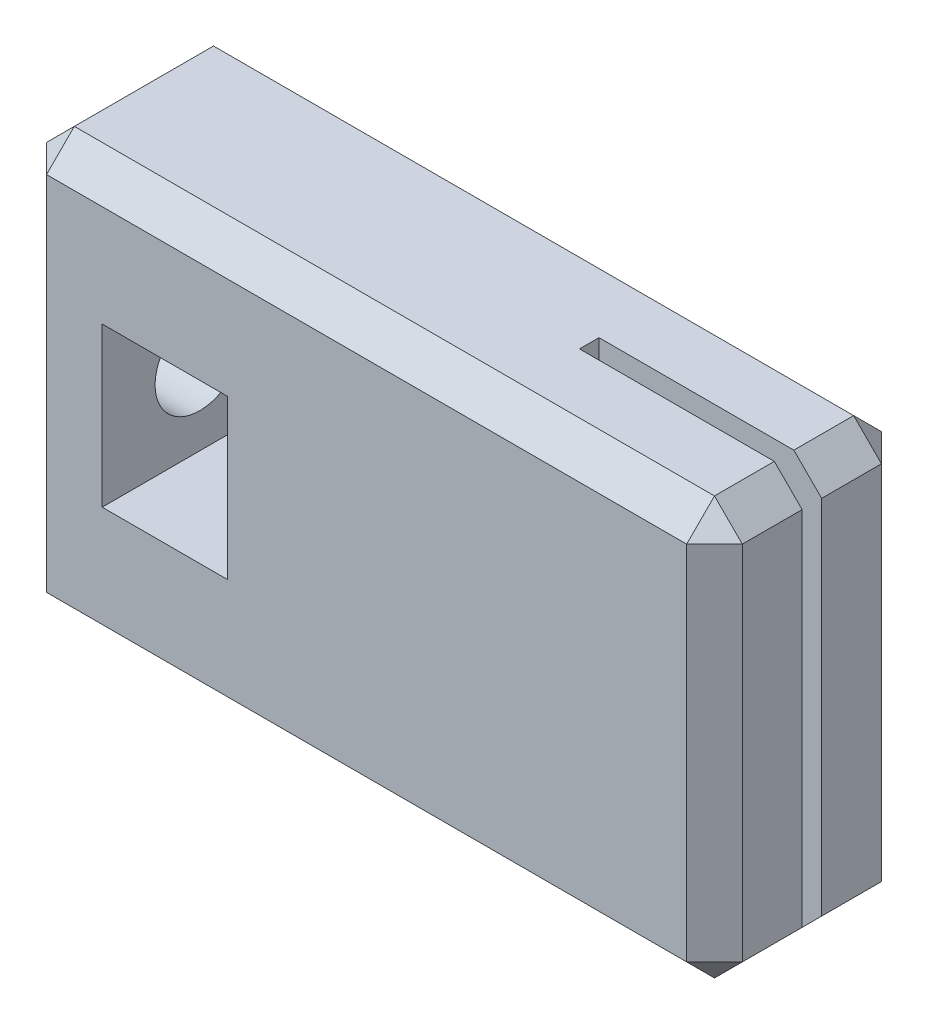
ISO-10303-21;
HEADER;
FILE_DESCRIPTION(('STEP AP214'),'2;1');
FILE_NAME('part.step','',(''),(''),'','','');
FILE_SCHEMA(('AUTOMOTIVE_DESIGN { 1 0 10303 214 1 1 1 1 }'));
ENDSEC;
DATA;
#1=APPLICATION_CONTEXT('core data for automotive mechanical design processes');
#2=APPLICATION_PROTOCOL_DEFINITION('international standard','automotive_design',2000,#1);
#3=PRODUCT_CONTEXT('',#1,'mechanical');
#4=PRODUCT('Part','Part','',(#3));
#5=PRODUCT_RELATED_PRODUCT_CATEGORY('part','',(#4));
#6=PRODUCT_DEFINITION_FORMATION('','',#4);
#7=PRODUCT_DEFINITION_CONTEXT('part definition',#1,'design');
#8=PRODUCT_DEFINITION('design','',#6,#7);
#9=PRODUCT_DEFINITION_SHAPE('','',#8);
#10=(LENGTH_UNIT() NAMED_UNIT(*) SI_UNIT(.MILLI.,.METRE.));
#11=(NAMED_UNIT(*) PLANE_ANGLE_UNIT() SI_UNIT($,.RADIAN.));
#12=(NAMED_UNIT(*) SI_UNIT($,.STERADIAN.) SOLID_ANGLE_UNIT());
#13=UNCERTAINTY_MEASURE_WITH_UNIT(LENGTH_MEASURE(1.E-05),#10,'distance_accuracy_value','');
#14=(GEOMETRIC_REPRESENTATION_CONTEXT(3) GLOBAL_UNCERTAINTY_ASSIGNED_CONTEXT((#13)) GLOBAL_UNIT_ASSIGNED_CONTEXT((#10,
#11,#12)) REPRESENTATION_CONTEXT('',''));
#15=CARTESIAN_POINT('',(0.,0.,0.));
#16=DIRECTION('',(0.,0.,1.));
#17=DIRECTION('',(1.,0.,0.));
#18=AXIS2_PLACEMENT_3D('',#15,#16,#17);
#19=CARTESIAN_POINT('',(16.,0.,0.));
#20=DIRECTION('',(-1.,0.,0.));
#21=DIRECTION('',(0.,0.,1.));
#22=AXIS2_PLACEMENT_3D('',#19,#20,#21);
#23=CYLINDRICAL_SURFACE('',#22,1.6);
#24=CARTESIAN_POINT('',(3.,0.,0.));
#25=DIRECTION('',(-1.,0.,0.));
#26=DIRECTION('',(0.,0.,1.));
#27=AXIS2_PLACEMENT_3D('',#24,#25,#26);
#28=CIRCLE('',#27,1.6);
#29=CARTESIAN_POINT('',(3.,0.,1.6));
#30=VERTEX_POINT('',#29);
#31=EDGE_CURVE('E236',#30,#30,#28,.F.);
#32=ORIENTED_EDGE('',*,*,#31,.T.);
#33=EDGE_LOOP('',(#32));
#34=FACE_BOUND('',#33,.T.);
#35=CARTESIAN_POINT('',(0.,0.,0.));
#36=DIRECTION('',(-1.,0.,0.));
#37=DIRECTION('',(0.,0.,1.));
#38=AXIS2_PLACEMENT_3D('',#35,#36,#37);
#39=CIRCLE('',#38,1.6);
#40=CARTESIAN_POINT('',(0.,0.,1.6));
#41=VERTEX_POINT('',#40);
#42=EDGE_CURVE('E233',#41,#41,#39,.T.);
#43=ORIENTED_EDGE('',*,*,#42,.T.);
#44=EDGE_LOOP('',(#43));
#45=FACE_BOUND('',#44,.T.);
#46=ADVANCED_FACE('F35',(#34,#45),#23,.F.);
#47=CARTESIAN_POINT('',(0.,7.5,-3.5));
#48=DIRECTION('',(1.,0.,0.));
#49=DIRECTION('',(0.,0.,-1.));
#50=AXIS2_PLACEMENT_3D('',#47,#48,#49);
#51=PLANE('',#50);
#52=DIRECTION('',(0.,-1.,0.));
#53=VECTOR('',#52,1.);
#54=CARTESIAN_POINT('',(0.,7.5,-2.5));
#55=LINE('',#54,#53);
#56=CARTESIAN_POINT('',(0.,6.49999999999999,-2.5));
#57=VERTEX_POINT('',#56);
#58=CARTESIAN_POINT('',(0.,-6.5,-2.5));
#59=VERTEX_POINT('',#58);
#60=EDGE_CURVE('E268',#57,#59,#55,.T.);
#61=ORIENTED_EDGE('',*,*,#60,.T.);
#62=DIRECTION('',(0.,0.,1.));
#63=VECTOR('',#62,1.);
#64=CARTESIAN_POINT('',(0.,-6.5,-3.5));
#65=LINE('',#64,#63);
#66=CARTESIAN_POINT('',(0.,-6.5,2.5));
#67=VERTEX_POINT('',#66);
#68=EDGE_CURVE('E272',#59,#67,#65,.T.);
#69=ORIENTED_EDGE('',*,*,#68,.T.);
#70=DIRECTION('',(0.,1.,0.));
#71=VECTOR('',#70,1.);
#72=CARTESIAN_POINT('',(0.,7.5,2.5));
#73=LINE('',#72,#71);
#74=CARTESIAN_POINT('',(0.,6.49999999999999,2.5));
#75=VERTEX_POINT('',#74);
#76=EDGE_CURVE('E270',#67,#75,#73,.T.);
#77=ORIENTED_EDGE('',*,*,#76,.T.);
#78=DIRECTION('',(0.,0.,-1.));
#79=VECTOR('',#78,1.);
#80=CARTESIAN_POINT('',(0.,6.49999999999999,-3.5));
#81=LINE('',#80,#79);
#82=EDGE_CURVE('E262',#75,#57,#81,.T.);
#83=ORIENTED_EDGE('',*,*,#82,.T.);
#84=EDGE_LOOP('',(#61,#69,#77,#83));
#85=FACE_BOUND('',#84,.T.);
#86=ORIENTED_EDGE('',*,*,#42,.F.);
#87=EDGE_LOOP('',(#86));
#88=FACE_BOUND('',#87,.T.);
#89=ADVANCED_FACE('F510',(#85,#88),#51,.F.);
#90=CARTESIAN_POINT('',(0.,7.5,3.5));
#91=DIRECTION('',(0.,0.,-1.));
#92=DIRECTION('',(-1.,0.,0.));
#93=AXIS2_PLACEMENT_3D('',#90,#91,#92);
#94=PLANE('',#93);
#95=DIRECTION('',(-1.,0.,0.));
#96=VECTOR('',#95,1.);
#97=CARTESIAN_POINT('',(0.,6.49999999999999,3.5));
#98=LINE('',#97,#96);
#99=CARTESIAN_POINT('',(24.,6.49999999999999,3.5));
#100=VERTEX_POINT('',#99);
#101=CARTESIAN_POINT('',(1.00000000000001,6.49999999999999,3.5));
#102=VERTEX_POINT('',#101);
#103=EDGE_CURVE('E286',#100,#102,#98,.T.);
#104=ORIENTED_EDGE('',*,*,#103,.T.);
#105=DIRECTION('',(0.,-1.,0.));
#106=VECTOR('',#105,1.);
#107=CARTESIAN_POINT('',(1.00000000000001,7.5,3.5));
#108=LINE('',#107,#106);
#109=CARTESIAN_POINT('',(1.00000000000001,-6.49999999999999,3.5));
#110=VERTEX_POINT('',#109);
#111=EDGE_CURVE('E292',#102,#110,#108,.T.);
#112=ORIENTED_EDGE('',*,*,#111,.T.);
#113=DIRECTION('',(1.,0.,0.));
#114=VECTOR('',#113,1.);
#115=CARTESIAN_POINT('',(0.,-6.49999999999999,3.5));
#116=LINE('',#115,#114);
#117=CARTESIAN_POINT('',(24.,-6.49999999999999,3.5));
#118=VERTEX_POINT('',#117);
#119=EDGE_CURVE('E290',#110,#118,#116,.T.);
#120=ORIENTED_EDGE('',*,*,#119,.T.);
#121=DIRECTION('',(0.,1.,0.));
#122=VECTOR('',#121,1.);
#123=CARTESIAN_POINT('',(24.,7.5,3.5));
#124=LINE('',#123,#122);
#125=EDGE_CURVE('E288',#118,#100,#124,.T.);
#126=ORIENTED_EDGE('',*,*,#125,.T.);
#127=EDGE_LOOP('',(#104,#112,#120,#126));
#128=FACE_BOUND('',#127,.T.);
#129=DIRECTION('',(1.,0.,0.));
#130=VECTOR('',#129,1.);
#131=CARTESIAN_POINT('',(3.,-2.85,3.5));
#132=LINE('',#131,#130);
#133=CARTESIAN_POINT('',(3.,-2.85,3.5));
#134=VERTEX_POINT('',#133);
#135=CARTESIAN_POINT('',(7.5,-2.85,3.5));
#136=VERTEX_POINT('',#135);
#137=EDGE_CURVE('E219',#134,#136,#132,.T.);
#138=ORIENTED_EDGE('',*,*,#137,.F.);
#139=DIRECTION('',(0.,-1.,0.));
#140=VECTOR('',#139,1.);
#141=CARTESIAN_POINT('',(3.,2.85,3.5));
#142=LINE('',#141,#140);
#143=CARTESIAN_POINT('',(3.,2.85,3.5));
#144=VERTEX_POINT('',#143);
#145=EDGE_CURVE('E193',#144,#134,#142,.T.);
#146=ORIENTED_EDGE('',*,*,#145,.F.);
#147=DIRECTION('',(-1.,0.,0.));
#148=VECTOR('',#147,1.);
#149=CARTESIAN_POINT('',(3.,2.85,3.5));
#150=LINE('',#149,#148);
#151=CARTESIAN_POINT('',(7.5,2.85,3.5));
#152=VERTEX_POINT('',#151);
#153=EDGE_CURVE('E210',#152,#144,#150,.T.);
#154=ORIENTED_EDGE('',*,*,#153,.F.);
#155=DIRECTION('',(0.,1.,0.));
#156=VECTOR('',#155,1.);
#157=CARTESIAN_POINT('',(7.5,2.85,3.5));
#158=LINE('',#157,#156);
#159=EDGE_CURVE('E213',#136,#152,#158,.T.);
#160=ORIENTED_EDGE('',*,*,#159,.F.);
#161=EDGE_LOOP('',(#138,#146,#154,#160));
#162=FACE_BOUND('',#161,.T.);
#163=ADVANCED_FACE('F517',(#128,#162),#94,.F.);
#164=CARTESIAN_POINT('',(25.,7.5,0.35));
#165=DIRECTION('',(-1.,0.,0.));
#166=DIRECTION('',(0.,0.,1.));
#167=AXIS2_PLACEMENT_3D('',#164,#165,#166);
#168=PLANE('',#167);
#169=DIRECTION('',(0.,-1.,0.));
#170=VECTOR('',#169,1.);
#171=CARTESIAN_POINT('',(25.,7.5,2.5));
#172=LINE('',#171,#170);
#173=CARTESIAN_POINT('',(25.,6.49999999999999,2.5));
#174=VERTEX_POINT('',#173);
#175=CARTESIAN_POINT('',(25.,-6.5,2.5));
#176=VERTEX_POINT('',#175);
#177=EDGE_CURVE('E52',#174,#176,#172,.T.);
#178=ORIENTED_EDGE('',*,*,#177,.T.);
#179=DIRECTION('',(0.,0.,-1.));
#180=VECTOR('',#179,1.);
#181=CARTESIAN_POINT('',(25.,-6.5,0.35));
#182=LINE('',#181,#180);
#183=CARTESIAN_POINT('',(25.,-6.49999999999999,0.35));
#184=VERTEX_POINT('',#183);
#185=EDGE_CURVE('E326',#176,#184,#182,.T.);
#186=ORIENTED_EDGE('',*,*,#185,.T.);
#187=DIRECTION('',(0.,-1.,0.));
#188=VECTOR('',#187,1.);
#189=CARTESIAN_POINT('',(25.,7.5,0.35));
#190=LINE('',#189,#188);
#191=CARTESIAN_POINT('',(25.,6.49999999999999,0.35));
#192=VERTEX_POINT('',#191);
#193=EDGE_CURVE('E259',#192,#184,#190,.T.);
#194=ORIENTED_EDGE('',*,*,#193,.F.);
#195=DIRECTION('',(0.,0.,1.));
#196=VECTOR('',#195,1.);
#197=CARTESIAN_POINT('',(25.,6.49999999999999,3.5));
#198=LINE('',#197,#196);
#199=EDGE_CURVE('E57',#192,#174,#198,.T.);
#200=ORIENTED_EDGE('',*,*,#199,.T.);
#201=EDGE_LOOP('',(#178,#186,#194,#200));
#202=FACE_BOUND('',#201,.T.);
#203=ADVANCED_FACE('F446',(#202),#168,.F.);
#204=CARTESIAN_POINT('',(25.,7.5,0.35));
#205=DIRECTION('',(0.,0.,1.));
#206=DIRECTION('',(1.,0.,0.));
#207=AXIS2_PLACEMENT_3D('',#204,#205,#206);
#208=PLANE('',#207);
#209=ORIENTED_EDGE('',*,*,#193,.T.);
#210=DIRECTION('',(0.707106781186549,0.707106781186546,0.));
#211=VECTOR('',#210,1.);
#212=CARTESIAN_POINT('',(25.,-6.5,0.35));
#213=LINE('',#212,#211);
#214=CARTESIAN_POINT('',(24.,-7.5,0.35));
#215=VERTEX_POINT('',#214);
#216=EDGE_CURVE('E11',#184,#215,#213,.F.);
#217=ORIENTED_EDGE('',*,*,#216,.T.);
#218=DIRECTION('',(-1.,0.,0.));
#219=VECTOR('',#218,1.);
#220=CARTESIAN_POINT('',(25.,-7.5,0.35));
#221=LINE('',#220,#219);
#222=CARTESIAN_POINT('',(17.,-7.5,0.35));
#223=VERTEX_POINT('',#222);
#224=EDGE_CURVE('E232',#215,#223,#221,.T.);
#225=ORIENTED_EDGE('',*,*,#224,.T.);
#226=DIRECTION('',(0.,-1.,0.));
#227=VECTOR('',#226,1.);
#228=CARTESIAN_POINT('',(17.,7.5,0.35));
#229=LINE('',#228,#227);
#230=CARTESIAN_POINT('',(17.,7.5,0.35));
#231=VERTEX_POINT('',#230);
#232=EDGE_CURVE('E256',#231,#223,#229,.T.);
#233=ORIENTED_EDGE('',*,*,#232,.F.);
#234=DIRECTION('',(-1.,0.,0.));
#235=VECTOR('',#234,1.);
#236=CARTESIAN_POINT('',(25.,7.5,0.35));
#237=LINE('',#236,#235);
#238=CARTESIAN_POINT('',(24.,7.5,0.35));
#239=VERTEX_POINT('',#238);
#240=EDGE_CURVE('E237',#239,#231,#237,.T.);
#241=ORIENTED_EDGE('',*,*,#240,.F.);
#242=DIRECTION('',(0.707106781186546,-0.707106781186549,0.));
#243=VECTOR('',#242,1.);
#244=CARTESIAN_POINT('',(24.,7.5,0.35));
#245=LINE('',#244,#243);
#246=EDGE_CURVE('E44',#239,#192,#245,.T.);
#247=ORIENTED_EDGE('',*,*,#246,.T.);
#248=EDGE_LOOP('',(#209,#217,#225,#233,#241,#247));
#249=FACE_BOUND('',#248,.T.);
#250=ADVANCED_FACE('F443',(#249),#208,.F.);
#251=CARTESIAN_POINT('',(17.,7.5,-0.35));
#252=DIRECTION('',(-1.,0.,0.));
#253=DIRECTION('',(0.,0.,1.));
#254=AXIS2_PLACEMENT_3D('',#251,#252,#253);
#255=PLANE('',#254);
#256=DIRECTION('',(0.,0.,-1.));
#257=VECTOR('',#256,1.);
#258=CARTESIAN_POINT('',(17.,-7.5,-0.35));
#259=LINE('',#258,#257);
#260=CARTESIAN_POINT('',(17.,-7.5,-0.35));
#261=VERTEX_POINT('',#260);
#262=EDGE_CURVE('E247',#223,#261,#259,.T.);
#263=ORIENTED_EDGE('',*,*,#262,.T.);
#264=DIRECTION('',(0.,-1.,0.));
#265=VECTOR('',#264,1.);
#266=CARTESIAN_POINT('',(17.,7.5,-0.35));
#267=LINE('',#266,#265);
#268=CARTESIAN_POINT('',(17.,7.5,-0.35));
#269=VERTEX_POINT('',#268);
#270=EDGE_CURVE('E253',#269,#261,#267,.T.);
#271=ORIENTED_EDGE('',*,*,#270,.F.);
#272=DIRECTION('',(0.,0.,-1.));
#273=VECTOR('',#272,1.);
#274=CARTESIAN_POINT('',(17.,7.5,-0.35));
#275=LINE('',#274,#273);
#276=EDGE_CURVE('E239',#231,#269,#275,.T.);
#277=ORIENTED_EDGE('',*,*,#276,.F.);
#278=ORIENTED_EDGE('',*,*,#232,.T.);
#279=EDGE_LOOP('',(#263,#271,#277,#278));
#280=FACE_BOUND('',#279,.T.);
#281=ADVANCED_FACE('F471',(#280),#255,.F.);
#282=CARTESIAN_POINT('',(25.,7.5,-0.35));
#283=DIRECTION('',(0.,0.,-1.));
#284=DIRECTION('',(-1.,0.,0.));
#285=AXIS2_PLACEMENT_3D('',#282,#283,#284);
#286=PLANE('',#285);
#287=DIRECTION('',(1.,0.,0.));
#288=VECTOR('',#287,1.);
#289=CARTESIAN_POINT('',(25.,-7.5,-0.35));
#290=LINE('',#289,#288);
#291=CARTESIAN_POINT('',(24.,-7.5,-0.35));
#292=VERTEX_POINT('',#291);
#293=EDGE_CURVE('E240',#261,#292,#290,.T.);
#294=ORIENTED_EDGE('',*,*,#293,.T.);
#295=DIRECTION('',(-0.707106781186549,-0.707106781186546,0.));
#296=VECTOR('',#295,1.);
#297=CARTESIAN_POINT('',(25.,-6.5,-0.35));
#298=LINE('',#297,#296);
#299=CARTESIAN_POINT('',(25.,-6.49999999999999,-0.35));
#300=VERTEX_POINT('',#299);
#301=EDGE_CURVE('E312',#292,#300,#298,.F.);
#302=ORIENTED_EDGE('',*,*,#301,.T.);
#303=DIRECTION('',(0.,-1.,0.));
#304=VECTOR('',#303,1.);
#305=CARTESIAN_POINT('',(25.,7.5,-0.35));
#306=LINE('',#305,#304);
#307=CARTESIAN_POINT('',(25.,6.49999999999999,-0.35));
#308=VERTEX_POINT('',#307);
#309=EDGE_CURVE('E245',#308,#300,#306,.T.);
#310=ORIENTED_EDGE('',*,*,#309,.F.);
#311=DIRECTION('',(-0.707106781186546,0.707106781186549,0.));
#312=VECTOR('',#311,1.);
#313=CARTESIAN_POINT('',(24.,7.5,-0.35));
#314=LINE('',#313,#312);
#315=CARTESIAN_POINT('',(24.,7.5,-0.35));
#316=VERTEX_POINT('',#315);
#317=EDGE_CURVE('E310',#308,#316,#314,.T.);
#318=ORIENTED_EDGE('',*,*,#317,.T.);
#319=DIRECTION('',(1.,0.,0.));
#320=VECTOR('',#319,1.);
#321=CARTESIAN_POINT('',(25.,7.5,-0.35));
#322=LINE('',#321,#320);
#323=EDGE_CURVE('E242',#269,#316,#322,.T.);
#324=ORIENTED_EDGE('',*,*,#323,.F.);
#325=ORIENTED_EDGE('',*,*,#270,.T.);
#326=EDGE_LOOP('',(#294,#302,#310,#318,#324,#325));
#327=FACE_BOUND('',#326,.T.);
#328=ADVANCED_FACE('F477',(#327),#286,.F.);
#329=CARTESIAN_POINT('',(25.,7.5,-3.5));
#330=DIRECTION('',(-1.,0.,0.));
#331=DIRECTION('',(0.,0.,1.));
#332=AXIS2_PLACEMENT_3D('',#329,#330,#331);
#333=PLANE('',#332);
#334=ORIENTED_EDGE('',*,*,#309,.T.);
#335=DIRECTION('',(0.,0.,-1.));
#336=VECTOR('',#335,1.);
#337=CARTESIAN_POINT('',(25.,-6.5,-3.5));
#338=LINE('',#337,#336);
#339=CARTESIAN_POINT('',(25.,-6.5,-2.49999999999999));
#340=VERTEX_POINT('',#339);
#341=EDGE_CURVE('E308',#300,#340,#338,.T.);
#342=ORIENTED_EDGE('',*,*,#341,.T.);
#343=DIRECTION('',(0.,1.,0.));
#344=VECTOR('',#343,1.);
#345=CARTESIAN_POINT('',(25.,7.5,-2.49999999999999));
#346=LINE('',#345,#344);
#347=CARTESIAN_POINT('',(25.,6.49999999999999,-2.49999999999999));
#348=VERTEX_POINT('',#347);
#349=EDGE_CURVE('E304',#340,#348,#346,.T.);
#350=ORIENTED_EDGE('',*,*,#349,.T.);
#351=DIRECTION('',(0.,0.,1.));
#352=VECTOR('',#351,1.);
#353=CARTESIAN_POINT('',(25.,6.49999999999999,-0.35));
#354=LINE('',#353,#352);
#355=EDGE_CURVE('E306',#348,#308,#354,.T.);
#356=ORIENTED_EDGE('',*,*,#355,.T.);
#357=EDGE_LOOP('',(#334,#342,#350,#356));
#358=FACE_BOUND('',#357,.T.);
#359=ADVANCED_FACE('F481',(#358),#333,.F.);
#360=CARTESIAN_POINT('',(0.,7.5,-3.5));
#361=DIRECTION('',(0.,0.,1.));
#362=DIRECTION('',(1.,0.,0.));
#363=AXIS2_PLACEMENT_3D('',#360,#361,#362);
#364=PLANE('',#363);
#365=DIRECTION('',(-1.,0.,0.));
#366=VECTOR('',#365,1.);
#367=CARTESIAN_POINT('',(0.,-6.5,-3.5));
#368=LINE('',#367,#366);
#369=CARTESIAN_POINT('',(24.,-6.5,-3.5));
#370=VERTEX_POINT('',#369);
#371=CARTESIAN_POINT('',(1.00000000000001,-6.5,-3.5));
#372=VERTEX_POINT('',#371);
#373=EDGE_CURVE('E299',#370,#372,#368,.T.);
#374=ORIENTED_EDGE('',*,*,#373,.T.);
#375=DIRECTION('',(0.,1.,0.));
#376=VECTOR('',#375,1.);
#377=CARTESIAN_POINT('',(1.00000000000001,7.5,-3.5));
#378=LINE('',#377,#376);
#379=CARTESIAN_POINT('',(1.00000000000001,6.49999999999999,-3.5));
#380=VERTEX_POINT('',#379);
#381=EDGE_CURVE('E301',#372,#380,#378,.T.);
#382=ORIENTED_EDGE('',*,*,#381,.T.);
#383=DIRECTION('',(1.,0.,0.));
#384=VECTOR('',#383,1.);
#385=CARTESIAN_POINT('',(25.,6.49999999999999,-3.5));
#386=LINE('',#385,#384);
#387=CARTESIAN_POINT('',(24.,6.49999999999999,-3.5));
#388=VERTEX_POINT('',#387);
#389=EDGE_CURVE('E295',#380,#388,#386,.T.);
#390=ORIENTED_EDGE('',*,*,#389,.T.);
#391=DIRECTION('',(0.,-1.,0.));
#392=VECTOR('',#391,1.);
#393=CARTESIAN_POINT('',(24.,7.5,-3.5));
#394=LINE('',#393,#392);
#395=EDGE_CURVE('E297',#388,#370,#394,.T.);
#396=ORIENTED_EDGE('',*,*,#395,.T.);
#397=EDGE_LOOP('',(#374,#382,#390,#396));
#398=FACE_BOUND('',#397,.T.);
#399=DIRECTION('',(-1.,0.,0.));
#400=VECTOR('',#399,1.);
#401=CARTESIAN_POINT('',(3.,2.85,-3.5));
#402=LINE('',#401,#400);
#403=CARTESIAN_POINT('',(7.5,2.85,-3.5));
#404=VERTEX_POINT('',#403);
#405=CARTESIAN_POINT('',(3.,2.85,-3.5));
#406=VERTEX_POINT('',#405);
#407=EDGE_CURVE('E198',#404,#406,#402,.T.);
#408=ORIENTED_EDGE('',*,*,#407,.T.);
#409=DIRECTION('',(0.,-1.,0.));
#410=VECTOR('',#409,1.);
#411=CARTESIAN_POINT('',(3.,2.85,-3.5));
#412=LINE('',#411,#410);
#413=CARTESIAN_POINT('',(3.,-2.85,-3.5));
#414=VERTEX_POINT('',#413);
#415=EDGE_CURVE('E190',#406,#414,#412,.T.);
#416=ORIENTED_EDGE('',*,*,#415,.T.);
#417=DIRECTION('',(1.,0.,0.));
#418=VECTOR('',#417,1.);
#419=CARTESIAN_POINT('',(3.,-2.85,-3.5));
#420=LINE('',#419,#418);
#421=CARTESIAN_POINT('',(7.5,-2.85,-3.5));
#422=VERTEX_POINT('',#421);
#423=EDGE_CURVE('E202',#414,#422,#420,.T.);
#424=ORIENTED_EDGE('',*,*,#423,.T.);
#425=DIRECTION('',(0.,1.,0.));
#426=VECTOR('',#425,1.);
#427=CARTESIAN_POINT('',(7.5,2.85,-3.5));
#428=LINE('',#427,#426);
#429=EDGE_CURVE('E206',#422,#404,#428,.T.);
#430=ORIENTED_EDGE('',*,*,#429,.T.);
#431=EDGE_LOOP('',(#408,#416,#424,#430));
#432=FACE_BOUND('',#431,.T.);
#433=ADVANCED_FACE('F208',(#398,#432),#364,.F.);
#434=CARTESIAN_POINT('',(0.,7.5,0.));
#435=DIRECTION('',(0.,1.,0.));
#436=DIRECTION('',(0.,0.,1.));
#437=AXIS2_PLACEMENT_3D('',#434,#435,#436);
#438=PLANE('',#437);
#439=ORIENTED_EDGE('',*,*,#323,.T.);
#440=DIRECTION('',(0.,0.,-1.));
#441=VECTOR('',#440,1.);
#442=CARTESIAN_POINT('',(24.,7.5,-3.5));
#443=LINE('',#442,#441);
#444=CARTESIAN_POINT('',(24.,7.5,-2.49999999999999));
#445=VERTEX_POINT('',#444);
#446=EDGE_CURVE('E322',#316,#445,#443,.T.);
#447=ORIENTED_EDGE('',*,*,#446,.T.);
#448=DIRECTION('',(-1.,0.,0.));
#449=VECTOR('',#448,1.);
#450=CARTESIAN_POINT('',(0.,7.5,-2.5));
#451=LINE('',#450,#449);
#452=CARTESIAN_POINT('',(1.00000000000001,7.5,-2.5));
#453=VERTEX_POINT('',#452);
#454=EDGE_CURVE('E320',#445,#453,#451,.T.);
#455=ORIENTED_EDGE('',*,*,#454,.T.);
#456=DIRECTION('',(0.,0.,1.));
#457=VECTOR('',#456,1.);
#458=CARTESIAN_POINT('',(1.00000000000001,7.5,3.5));
#459=LINE('',#458,#457);
#460=CARTESIAN_POINT('',(1.00000000000001,7.5,2.5));
#461=VERTEX_POINT('',#460);
#462=EDGE_CURVE('E318',#453,#461,#459,.T.);
#463=ORIENTED_EDGE('',*,*,#462,.T.);
#464=DIRECTION('',(1.,0.,0.));
#465=VECTOR('',#464,1.);
#466=CARTESIAN_POINT('',(25.,7.5,2.49999999999999));
#467=LINE('',#466,#465);
#468=CARTESIAN_POINT('',(24.,7.5,2.49999999999999));
#469=VERTEX_POINT('',#468);
#470=EDGE_CURVE('E314',#461,#469,#467,.T.);
#471=ORIENTED_EDGE('',*,*,#470,.T.);
#472=DIRECTION('',(0.,0.,-1.));
#473=VECTOR('',#472,1.);
#474=CARTESIAN_POINT('',(24.,7.5,0.35));
#475=LINE('',#474,#473);
#476=EDGE_CURVE('E316',#469,#239,#475,.T.);
#477=ORIENTED_EDGE('',*,*,#476,.T.);
#478=ORIENTED_EDGE('',*,*,#240,.T.);
#479=ORIENTED_EDGE('',*,*,#276,.T.);
#480=EDGE_LOOP('',(#439,#447,#455,#463,#471,#477,#478,#479));
#481=FACE_BOUND('',#480,.T.);
#482=ADVANCED_FACE('F421',(#481),#438,.T.);
#483=CARTESIAN_POINT('',(0.,-7.5,0.));
#484=DIRECTION('',(0.,1.,0.));
#485=DIRECTION('',(0.,0.,1.));
#486=AXIS2_PLACEMENT_3D('',#483,#484,#485);
#487=PLANE('',#486);
#488=DIRECTION('',(1.,0.,0.));
#489=VECTOR('',#488,1.);
#490=CARTESIAN_POINT('',(0.,-7.5,-2.49999999999999));
#491=LINE('',#490,#489);
#492=CARTESIAN_POINT('',(1.00000000000001,-7.5,-2.49999999999999));
#493=VERTEX_POINT('',#492);
#494=CARTESIAN_POINT('',(24.,-7.5,-2.49999999999999));
#495=VERTEX_POINT('',#494);
#496=EDGE_CURVE('E282',#493,#495,#491,.T.);
#497=ORIENTED_EDGE('',*,*,#496,.T.);
#498=DIRECTION('',(0.,0.,1.));
#499=VECTOR('',#498,1.);
#500=CARTESIAN_POINT('',(24.,-7.5,0.));
#501=LINE('',#500,#499);
#502=EDGE_CURVE('E284',#495,#292,#501,.T.);
#503=ORIENTED_EDGE('',*,*,#502,.T.);
#504=ORIENTED_EDGE('',*,*,#293,.F.);
#505=ORIENTED_EDGE('',*,*,#262,.F.);
#506=ORIENTED_EDGE('',*,*,#224,.F.);
#507=DIRECTION('',(0.,0.,1.));
#508=VECTOR('',#507,1.);
#509=CARTESIAN_POINT('',(24.,-7.5,0.));
#510=LINE('',#509,#508);
#511=CARTESIAN_POINT('',(24.,-7.5,2.49999999999999));
#512=VERTEX_POINT('',#511);
#513=EDGE_CURVE('E277',#215,#512,#510,.T.);
#514=ORIENTED_EDGE('',*,*,#513,.T.);
#515=DIRECTION('',(-1.,0.,0.));
#516=VECTOR('',#515,1.);
#517=CARTESIAN_POINT('',(0.,-7.5,2.5));
#518=LINE('',#517,#516);
#519=CARTESIAN_POINT('',(1.00000000000001,-7.5,2.5));
#520=VERTEX_POINT('',#519);
#521=EDGE_CURVE('E275',#512,#520,#518,.T.);
#522=ORIENTED_EDGE('',*,*,#521,.T.);
#523=DIRECTION('',(0.,0.,-1.));
#524=VECTOR('',#523,1.);
#525=CARTESIAN_POINT('',(1.00000000000001,-7.5,0.));
#526=LINE('',#525,#524);
#527=EDGE_CURVE('E279',#520,#493,#526,.T.);
#528=ORIENTED_EDGE('',*,*,#527,.T.);
#529=EDGE_LOOP('',(#497,#503,#504,#505,#506,#514,#522,#528));
#530=FACE_BOUND('',#529,.T.);
#531=ADVANCED_FACE('F465',(#530),#487,.F.);
#532=CARTESIAN_POINT('',(3.,2.85,-3.5));
#533=DIRECTION('',(-1.,0.,0.));
#534=DIRECTION('',(0.,0.,1.));
#535=AXIS2_PLACEMENT_3D('',#532,#533,#534);
#536=PLANE('',#535);
#537=ORIENTED_EDGE('',*,*,#145,.T.);
#538=DIRECTION('',(0.,0.,1.));
#539=VECTOR('',#538,1.);
#540=CARTESIAN_POINT('',(3.,-2.85,-3.5));
#541=LINE('',#540,#539);
#542=EDGE_CURVE('E185',#414,#134,#541,.T.);
#543=ORIENTED_EDGE('',*,*,#542,.F.);
#544=ORIENTED_EDGE('',*,*,#415,.F.);
#545=DIRECTION('',(0.,0.,1.));
#546=VECTOR('',#545,1.);
#547=CARTESIAN_POINT('',(3.,2.85,-3.5));
#548=LINE('',#547,#546);
#549=EDGE_CURVE('E223',#406,#144,#548,.T.);
#550=ORIENTED_EDGE('',*,*,#549,.T.);
#551=EDGE_LOOP('',(#537,#543,#544,#550));
#552=FACE_BOUND('',#551,.T.);
#553=ORIENTED_EDGE('',*,*,#31,.F.);
#554=EDGE_LOOP('',(#553));
#555=FACE_BOUND('',#554,.T.);
#556=ADVANCED_FACE('F187',(#552,#555),#536,.F.);
#557=CARTESIAN_POINT('',(7.5,2.85,-3.5));
#558=DIRECTION('',(1.,0.,0.));
#559=DIRECTION('',(0.,0.,-1.));
#560=AXIS2_PLACEMENT_3D('',#557,#558,#559);
#561=PLANE('',#560);
#562=ORIENTED_EDGE('',*,*,#159,.T.);
#563=DIRECTION('',(0.,0.,1.));
#564=VECTOR('',#563,1.);
#565=CARTESIAN_POINT('',(7.5,2.85,-3.5));
#566=LINE('',#565,#564);
#567=EDGE_CURVE('E226',#404,#152,#566,.T.);
#568=ORIENTED_EDGE('',*,*,#567,.F.);
#569=ORIENTED_EDGE('',*,*,#429,.F.);
#570=DIRECTION('',(0.,0.,1.));
#571=VECTOR('',#570,1.);
#572=CARTESIAN_POINT('',(7.5,-2.85,-3.5));
#573=LINE('',#572,#571);
#574=EDGE_CURVE('E197',#422,#136,#573,.T.);
#575=ORIENTED_EDGE('',*,*,#574,.T.);
#576=EDGE_LOOP('',(#562,#568,#569,#575));
#577=FACE_BOUND('',#576,.T.);
#578=CARTESIAN_POINT('',(7.5,0.,0.));
#579=DIRECTION('',(1.,0.,0.));
#580=DIRECTION('',(0.,0.,-1.));
#581=AXIS2_PLACEMENT_3D('',#578,#579,#580);
#582=CIRCLE('',#581,1.6);
#583=CARTESIAN_POINT('',(7.5,0.,-1.6));
#584=VERTEX_POINT('',#583);
#585=EDGE_CURVE('E225',#584,#584,#582,.F.);
#586=ORIENTED_EDGE('',*,*,#585,.F.);
#587=EDGE_LOOP('',(#586));
#588=FACE_BOUND('',#587,.T.);
#589=ADVANCED_FACE('F535',(#577,#588),#561,.F.);
#590=CARTESIAN_POINT('',(3.,2.85,-3.5));
#591=DIRECTION('',(0.,1.,0.));
#592=DIRECTION('',(0.,0.,1.));
#593=AXIS2_PLACEMENT_3D('',#590,#591,#592);
#594=PLANE('',#593);
#595=ORIENTED_EDGE('',*,*,#153,.T.);
#596=ORIENTED_EDGE('',*,*,#549,.F.);
#597=ORIENTED_EDGE('',*,*,#407,.F.);
#598=ORIENTED_EDGE('',*,*,#567,.T.);
#599=EDGE_LOOP('',(#595,#596,#597,#598));
#600=FACE_BOUND('',#599,.T.);
#601=ADVANCED_FACE('F537',(#600),#594,.F.);
#602=CARTESIAN_POINT('',(3.,-2.85,-3.5));
#603=DIRECTION('',(0.,-1.,0.));
#604=DIRECTION('',(0.,0.,-1.));
#605=AXIS2_PLACEMENT_3D('',#602,#603,#604);
#606=PLANE('',#605);
#607=ORIENTED_EDGE('',*,*,#137,.T.);
#608=ORIENTED_EDGE('',*,*,#574,.F.);
#609=ORIENTED_EDGE('',*,*,#423,.F.);
#610=ORIENTED_EDGE('',*,*,#542,.T.);
#611=EDGE_LOOP('',(#607,#608,#609,#610));
#612=FACE_BOUND('',#611,.T.);
#613=ADVANCED_FACE('F203',(#612),#606,.F.);
#614=CARTESIAN_POINT('',(16.,0.,0.));
#615=DIRECTION('',(-1.,0.,0.));
#616=DIRECTION('',(0.,0.,1.));
#617=AXIS2_PLACEMENT_3D('',#614,#615,#616);
#618=PLANE('',#617);
#619=CARTESIAN_POINT('',(16.,0.,0.));
#620=DIRECTION('',(-1.,0.,0.));
#621=DIRECTION('',(0.,0.,1.));
#622=AXIS2_PLACEMENT_3D('',#619,#620,#621);
#623=CIRCLE('',#622,1.6);
#624=CARTESIAN_POINT('',(16.,0.,1.6));
#625=VERTEX_POINT('',#624);
#626=EDGE_CURVE('E229',#625,#625,#623,.T.);
#627=ORIENTED_EDGE('',*,*,#626,.T.);
#628=EDGE_LOOP('',(#627));
#629=FACE_BOUND('',#628,.T.);
#630=ADVANCED_FACE('F524',(#629),#618,.T.);
#631=ORIENTED_EDGE('',*,*,#585,.T.);
#632=EDGE_LOOP('',(#631));
#633=FACE_BOUND('',#632,.T.);
#634=ORIENTED_EDGE('',*,*,#626,.F.);
#635=EDGE_LOOP('',(#634));
#636=FACE_BOUND('',#635,.T.);
#637=ADVANCED_FACE('F513',(#633,#636),#23,.F.);
#638=CARTESIAN_POINT('',(24.,7.5,0.));
#639=DIRECTION('',(0.707106781186549,0.707106781186546,0.));
#640=DIRECTION('',(0.,0.,1.));
#641=AXIS2_PLACEMENT_3D('',#638,#639,#640);
#642=PLANE('',#641);
#643=ORIENTED_EDGE('',*,*,#317,.F.);
#644=ORIENTED_EDGE('',*,*,#355,.F.);
#645=DIRECTION('',(0.707106781186546,-0.707106781186549,0.));
#646=VECTOR('',#645,1.);
#647=CARTESIAN_POINT('',(24.,7.5,-2.49999999999999));
#648=LINE('',#647,#646);
#649=EDGE_CURVE('E39',#445,#348,#648,.T.);
#650=ORIENTED_EDGE('',*,*,#649,.F.);
#651=ORIENTED_EDGE('',*,*,#446,.F.);
#652=EDGE_LOOP('',(#643,#644,#650,#651));
#653=FACE_BOUND('',#652,.T.);
#654=ADVANCED_FACE('F37',(#653),#642,.T.);
#655=CARTESIAN_POINT('',(24.,7.5,0.));
#656=DIRECTION('',(0.707106781186549,0.707106781186546,0.));
#657=DIRECTION('',(0.,0.,1.));
#658=AXIS2_PLACEMENT_3D('',#655,#656,#657);
#659=PLANE('',#658);
#660=ORIENTED_EDGE('',*,*,#246,.F.);
#661=ORIENTED_EDGE('',*,*,#476,.F.);
#662=DIRECTION('',(-0.707106781186546,0.707106781186549,0.));
#663=VECTOR('',#662,1.);
#664=CARTESIAN_POINT('',(25.,6.49999999999999,2.5));
#665=LINE('',#664,#663);
#666=EDGE_CURVE('E390',#174,#469,#665,.T.);
#667=ORIENTED_EDGE('',*,*,#666,.F.);
#668=ORIENTED_EDGE('',*,*,#199,.F.);
#669=EDGE_LOOP('',(#660,#661,#667,#668));
#670=FACE_BOUND('',#669,.T.);
#671=ADVANCED_FACE('F441',(#670),#659,.T.);
#672=CARTESIAN_POINT('',(24.,7.5,-2.49999999999999));
#673=DIRECTION('',(0.577350269189628,0.577350269189624,-0.577350269189626));
#674=DIRECTION('',(-0.707106781186546,0.,-0.707106781186549));
#675=AXIS2_PLACEMENT_3D('',#672,#673,#674);
#676=PLANE('',#675);
#677=DIRECTION('',(0.,0.707106781186549,0.707106781186546));
#678=VECTOR('',#677,1.);
#679=CARTESIAN_POINT('',(24.,7.5,-2.49999999999999));
#680=LINE('',#679,#678);
#681=EDGE_CURVE('E385',#445,#388,#680,.F.);
#682=ORIENTED_EDGE('',*,*,#681,.F.);
#683=ORIENTED_EDGE('',*,*,#649,.T.);
#684=DIRECTION('',(0.707106781186546,0.,0.707106781186549));
#685=VECTOR('',#684,1.);
#686=CARTESIAN_POINT('',(24.5,6.49999999999999,-3.));
#687=LINE('',#686,#685);
#688=EDGE_CURVE('E388',#388,#348,#687,.T.);
#689=ORIENTED_EDGE('',*,*,#688,.F.);
#690=EDGE_LOOP('',(#682,#683,#689));
#691=FACE_BOUND('',#690,.T.);
#692=ADVANCED_FACE('F400',(#691),#676,.T.);
#693=CARTESIAN_POINT('',(25.,6.49999999999999,2.5));
#694=DIRECTION('',(0.577350269189626,0.577350269189624,0.577350269189628));
#695=DIRECTION('',(0.707106781186549,0.,-0.707106781186546));
#696=AXIS2_PLACEMENT_3D('',#693,#694,#695);
#697=PLANE('',#696);
#698=DIRECTION('',(-0.707106781186549,0.,0.707106781186546));
#699=VECTOR('',#698,1.);
#700=CARTESIAN_POINT('',(25.,6.49999999999999,2.5));
#701=LINE('',#700,#699);
#702=EDGE_CURVE('E379',#174,#100,#701,.T.);
#703=ORIENTED_EDGE('',*,*,#702,.F.);
#704=ORIENTED_EDGE('',*,*,#666,.T.);
#705=DIRECTION('',(0.,-0.707106781186549,0.707106781186546));
#706=VECTOR('',#705,1.);
#707=CARTESIAN_POINT('',(24.,7.,3.));
#708=LINE('',#707,#706);
#709=EDGE_CURVE('E382',#100,#469,#708,.F.);
#710=ORIENTED_EDGE('',*,*,#709,.F.);
#711=EDGE_LOOP('',(#703,#704,#710));
#712=FACE_BOUND('',#711,.T.);
#713=ADVANCED_FACE('F605',(#712),#697,.T.);
#714=CARTESIAN_POINT('',(25.,-6.5,-3.5));
#715=DIRECTION('',(-0.707106781186546,0.707106781186549,0.));
#716=DIRECTION('',(0.,0.,-1.));
#717=AXIS2_PLACEMENT_3D('',#714,#715,#716);
#718=PLANE('',#717);
#719=ORIENTED_EDGE('',*,*,#301,.F.);
#720=ORIENTED_EDGE('',*,*,#502,.F.);
#721=DIRECTION('',(0.707106781186549,0.707106781186546,0.));
#722=VECTOR('',#721,1.);
#723=CARTESIAN_POINT('',(25.,-6.5,-2.49999999999999));
#724=LINE('',#723,#722);
#725=EDGE_CURVE('E376',#340,#495,#724,.F.);
#726=ORIENTED_EDGE('',*,*,#725,.F.);
#727=ORIENTED_EDGE('',*,*,#341,.F.);
#728=EDGE_LOOP('',(#719,#720,#726,#727));
#729=FACE_BOUND('',#728,.T.);
#730=ADVANCED_FACE('F483',(#729),#718,.F.);
#731=CARTESIAN_POINT('',(24.,7.5,-3.5));
#732=DIRECTION('',(-0.707106781186549,0.,0.707106781186546));
#733=DIRECTION('',(0.,-1.,0.));
#734=AXIS2_PLACEMENT_3D('',#731,#732,#733);
#735=PLANE('',#734);
#736=ORIENTED_EDGE('',*,*,#688,.T.);
#737=ORIENTED_EDGE('',*,*,#349,.F.);
#738=DIRECTION('',(-0.707106781186546,0.,-0.707106781186549));
#739=VECTOR('',#738,1.);
#740=CARTESIAN_POINT('',(25.,-6.5,-2.49999999999999));
#741=LINE('',#740,#739);
#742=EDGE_CURVE('E373',#370,#340,#741,.F.);
#743=ORIENTED_EDGE('',*,*,#742,.F.);
#744=ORIENTED_EDGE('',*,*,#395,.F.);
#745=EDGE_LOOP('',(#736,#737,#743,#744));
#746=FACE_BOUND('',#745,.T.);
#747=ADVANCED_FACE('F408',(#746),#735,.F.);
#748=CARTESIAN_POINT('',(0.,7.5,-2.5));
#749=DIRECTION('',(0.,0.707106781186546,-0.707106781186549));
#750=DIRECTION('',(1.,0.,0.));
#751=AXIS2_PLACEMENT_3D('',#748,#749,#750);
#752=PLANE('',#751);
#753=ORIENTED_EDGE('',*,*,#681,.T.);
#754=ORIENTED_EDGE('',*,*,#389,.F.);
#755=DIRECTION('',(0.,-0.707106781186549,-0.707106781186546));
#756=VECTOR('',#755,1.);
#757=CARTESIAN_POINT('',(1.00000000000001,6.49999999999999,-3.5));
#758=LINE('',#757,#756);
#759=EDGE_CURVE('E370',#453,#380,#758,.T.);
#760=ORIENTED_EDGE('',*,*,#759,.F.);
#761=ORIENTED_EDGE('',*,*,#454,.F.);
#762=EDGE_LOOP('',(#753,#754,#760,#761));
#763=FACE_BOUND('',#762,.T.);
#764=ADVANCED_FACE('F418',(#763),#752,.T.);
#765=CARTESIAN_POINT('',(1.00000000000001,7.5,0.));
#766=DIRECTION('',(-0.707106781186549,0.707106781186546,0.));
#767=DIRECTION('',(0.,0.,-1.));
#768=AXIS2_PLACEMENT_3D('',#765,#766,#767);
#769=PLANE('',#768);
#770=DIRECTION('',(-0.707106781186546,-0.707106781186549,0.));
#771=VECTOR('',#770,1.);
#772=CARTESIAN_POINT('',(0.,6.49999999999999,2.5));
#773=LINE('',#772,#771);
#774=EDGE_CURVE('E364',#461,#75,#773,.T.);
#775=ORIENTED_EDGE('',*,*,#774,.F.);
#776=ORIENTED_EDGE('',*,*,#462,.F.);
#777=DIRECTION('',(0.707106781186546,0.707106781186549,0.));
#778=VECTOR('',#777,1.);
#779=CARTESIAN_POINT('',(0.500000000000003,7.,-2.5));
#780=LINE('',#779,#778);
#781=EDGE_CURVE('E367',#57,#453,#780,.T.);
#782=ORIENTED_EDGE('',*,*,#781,.F.);
#783=ORIENTED_EDGE('',*,*,#82,.F.);
#784=EDGE_LOOP('',(#775,#776,#782,#783));
#785=FACE_BOUND('',#784,.T.);
#786=ADVANCED_FACE('F426',(#785),#769,.T.);
#787=CARTESIAN_POINT('',(0.,7.5,2.5));
#788=DIRECTION('',(0.,0.707106781186546,0.707106781186549));
#789=DIRECTION('',(-1.,0.,0.));
#790=AXIS2_PLACEMENT_3D('',#787,#788,#789);
#791=PLANE('',#790);
#792=ORIENTED_EDGE('',*,*,#709,.T.);
#793=ORIENTED_EDGE('',*,*,#470,.F.);
#794=DIRECTION('',(0.,0.707106781186549,-0.707106781186546));
#795=VECTOR('',#794,1.);
#796=CARTESIAN_POINT('',(1.00000000000001,7.,3.));
#797=LINE('',#796,#795);
#798=EDGE_CURVE('E361',#102,#461,#797,.T.);
#799=ORIENTED_EDGE('',*,*,#798,.F.);
#800=ORIENTED_EDGE('',*,*,#103,.F.);
#801=EDGE_LOOP('',(#792,#793,#799,#800));
#802=FACE_BOUND('',#801,.T.);
#803=ADVANCED_FACE('F436',(#802),#791,.T.);
#804=CARTESIAN_POINT('',(25.,7.5,2.5));
#805=DIRECTION('',(-0.707106781186546,0.,-0.707106781186549));
#806=DIRECTION('',(0.,-1.,0.));
#807=AXIS2_PLACEMENT_3D('',#804,#805,#806);
#808=PLANE('',#807);
#809=ORIENTED_EDGE('',*,*,#702,.T.);
#810=ORIENTED_EDGE('',*,*,#125,.F.);
#811=DIRECTION('',(0.707106781186549,0.,-0.707106781186546));
#812=VECTOR('',#811,1.);
#813=CARTESIAN_POINT('',(24.5,-6.49999999999999,3.));
#814=LINE('',#813,#812);
#815=EDGE_CURVE('E358',#176,#118,#814,.F.);
#816=ORIENTED_EDGE('',*,*,#815,.F.);
#817=ORIENTED_EDGE('',*,*,#177,.F.);
#818=EDGE_LOOP('',(#809,#810,#816,#817));
#819=FACE_BOUND('',#818,.T.);
#820=ADVANCED_FACE('F455',(#819),#808,.F.);
#821=CARTESIAN_POINT('',(25.,-6.5,0.35));
#822=DIRECTION('',(-0.707106781186546,0.707106781186549,0.));
#823=DIRECTION('',(0.,0.,-1.));
#824=AXIS2_PLACEMENT_3D('',#821,#822,#823);
#825=PLANE('',#824);
#826=ORIENTED_EDGE('',*,*,#216,.F.);
#827=ORIENTED_EDGE('',*,*,#185,.F.);
#828=DIRECTION('',(-0.707106781186549,-0.707106781186546,0.));
#829=VECTOR('',#828,1.);
#830=CARTESIAN_POINT('',(24.,-7.5,2.49999999999999));
#831=LINE('',#830,#829);
#832=EDGE_CURVE('E355',#512,#176,#831,.F.);
#833=ORIENTED_EDGE('',*,*,#832,.F.);
#834=ORIENTED_EDGE('',*,*,#513,.F.);
#835=EDGE_LOOP('',(#826,#827,#833,#834));
#836=FACE_BOUND('',#835,.T.);
#837=ADVANCED_FACE('F450',(#836),#825,.F.);
#838=CARTESIAN_POINT('',(25.,-6.5,-2.49999999999999));
#839=DIRECTION('',(0.577350269189626,-0.577350269189628,-0.577350269189624));
#840=DIRECTION('',(0.707106781186549,0.707106781186546,0.));
#841=AXIS2_PLACEMENT_3D('',#838,#839,#840);
#842=PLANE('',#841);
#843=ORIENTED_EDGE('',*,*,#742,.T.);
#844=ORIENTED_EDGE('',*,*,#725,.T.);
#845=DIRECTION('',(0.,-0.707106781186546,0.707106781186549));
#846=VECTOR('',#845,1.);
#847=CARTESIAN_POINT('',(24.,-7.,-3.));
#848=LINE('',#847,#846);
#849=EDGE_CURVE('E352',#370,#495,#848,.T.);
#850=ORIENTED_EDGE('',*,*,#849,.F.);
#851=EDGE_LOOP('',(#843,#844,#850));
#852=FACE_BOUND('',#851,.T.);
#853=ADVANCED_FACE('F486',(#852),#842,.T.);
#854=CARTESIAN_POINT('',(1.00000000000001,6.49999999999999,-3.5));
#855=DIRECTION('',(-0.577350269189626,0.577350269189624,-0.577350269189628));
#856=DIRECTION('',(-0.707106781186549,0.,0.707106781186546));
#857=AXIS2_PLACEMENT_3D('',#854,#855,#856);
#858=PLANE('',#857);
#859=ORIENTED_EDGE('',*,*,#781,.T.);
#860=ORIENTED_EDGE('',*,*,#759,.T.);
#861=DIRECTION('',(0.707106781186549,0.,-0.707106781186546));
#862=VECTOR('',#861,1.);
#863=CARTESIAN_POINT('',(1.00000000000001,6.49999999999999,-3.5));
#864=LINE('',#863,#862);
#865=EDGE_CURVE('E350',#57,#380,#864,.T.);
#866=ORIENTED_EDGE('',*,*,#865,.F.);
#867=EDGE_LOOP('',(#859,#860,#866));
#868=FACE_BOUND('',#867,.T.);
#869=ADVANCED_FACE('F500',(#868),#858,.T.);
#870=CARTESIAN_POINT('',(0.,6.49999999999999,2.5));
#871=DIRECTION('',(-0.577350269189626,0.577350269189624,0.577350269189628));
#872=DIRECTION('',(0.707106781186549,0.,0.707106781186546));
#873=AXIS2_PLACEMENT_3D('',#870,#871,#872);
#874=PLANE('',#873);
#875=ORIENTED_EDGE('',*,*,#798,.T.);
#876=ORIENTED_EDGE('',*,*,#774,.T.);
#877=DIRECTION('',(-0.707106781186549,0.,-0.707106781186546));
#878=VECTOR('',#877,1.);
#879=CARTESIAN_POINT('',(0.,6.49999999999999,2.5));
#880=LINE('',#879,#878);
#881=EDGE_CURVE('E347',#102,#75,#880,.T.);
#882=ORIENTED_EDGE('',*,*,#881,.F.);
#883=EDGE_LOOP('',(#875,#876,#882));
#884=FACE_BOUND('',#883,.T.);
#885=ADVANCED_FACE('F432',(#884),#874,.T.);
#886=CARTESIAN_POINT('',(24.,-7.5,2.49999999999999));
#887=DIRECTION('',(0.577350269189624,-0.577350269189626,0.577350269189628));
#888=DIRECTION('',(0.,-0.707106781186549,-0.707106781186546));
#889=AXIS2_PLACEMENT_3D('',#886,#887,#888);
#890=PLANE('',#889);
#891=ORIENTED_EDGE('',*,*,#832,.T.);
#892=ORIENTED_EDGE('',*,*,#815,.T.);
#893=DIRECTION('',(0.,0.707106781186549,0.707106781186546));
#894=VECTOR('',#893,1.);
#895=CARTESIAN_POINT('',(24.,-7.5,2.49999999999999));
#896=LINE('',#895,#894);
#897=EDGE_CURVE('E344',#512,#118,#896,.T.);
#898=ORIENTED_EDGE('',*,*,#897,.F.);
#899=EDGE_LOOP('',(#891,#892,#898));
#900=FACE_BOUND('',#899,.T.);
#901=ADVANCED_FACE('F457',(#900),#890,.T.);
#902=CARTESIAN_POINT('',(0.,-6.5,-3.5));
#903=DIRECTION('',(0.,0.707106781186549,0.707106781186546));
#904=DIRECTION('',(-1.,0.,0.));
#905=AXIS2_PLACEMENT_3D('',#902,#903,#904);
#906=PLANE('',#905);
#907=ORIENTED_EDGE('',*,*,#849,.T.);
#908=ORIENTED_EDGE('',*,*,#496,.F.);
#909=DIRECTION('',(0.,0.707106781186546,-0.707106781186549));
#910=VECTOR('',#909,1.);
#911=CARTESIAN_POINT('',(1.00000000000001,-7.5,-2.49999999999999));
#912=LINE('',#911,#910);
#913=EDGE_CURVE('E341',#372,#493,#912,.F.);
#914=ORIENTED_EDGE('',*,*,#913,.F.);
#915=ORIENTED_EDGE('',*,*,#373,.F.);
#916=EDGE_LOOP('',(#907,#908,#914,#915));
#917=FACE_BOUND('',#916,.T.);
#918=ADVANCED_FACE('F490',(#917),#906,.F.);
#919=CARTESIAN_POINT('',(0.,7.5,-2.5));
#920=DIRECTION('',(0.707106781186546,0.,0.707106781186549));
#921=DIRECTION('',(0.,-1.,0.));
#922=AXIS2_PLACEMENT_3D('',#919,#920,#921);
#923=PLANE('',#922);
#924=ORIENTED_EDGE('',*,*,#865,.T.);
#925=ORIENTED_EDGE('',*,*,#381,.F.);
#926=DIRECTION('',(-0.707106781186549,0.,0.707106781186546));
#927=VECTOR('',#926,1.);
#928=CARTESIAN_POINT('',(0.500000000000005,-6.5,-3.));
#929=LINE('',#928,#927);
#930=EDGE_CURVE('E338',#59,#372,#929,.F.);
#931=ORIENTED_EDGE('',*,*,#930,.F.);
#932=ORIENTED_EDGE('',*,*,#60,.F.);
#933=EDGE_LOOP('',(#924,#925,#931,#932));
#934=FACE_BOUND('',#933,.T.);
#935=ADVANCED_FACE('F498',(#934),#923,.F.);
#936=CARTESIAN_POINT('',(1.00000000000001,7.5,3.5));
#937=DIRECTION('',(0.707106781186546,0.,-0.707106781186549));
#938=DIRECTION('',(0.,-1.,0.));
#939=AXIS2_PLACEMENT_3D('',#936,#937,#938);
#940=PLANE('',#939);
#941=ORIENTED_EDGE('',*,*,#881,.T.);
#942=ORIENTED_EDGE('',*,*,#76,.F.);
#943=DIRECTION('',(0.707106781186549,0.,0.707106781186546));
#944=VECTOR('',#943,1.);
#945=CARTESIAN_POINT('',(0.,-6.5,2.5));
#946=LINE('',#945,#944);
#947=EDGE_CURVE('E335',#110,#67,#946,.F.);
#948=ORIENTED_EDGE('',*,*,#947,.F.);
#949=ORIENTED_EDGE('',*,*,#111,.F.);
#950=EDGE_LOOP('',(#941,#942,#948,#949));
#951=FACE_BOUND('',#950,.T.);
#952=ADVANCED_FACE('F697',(#951),#940,.F.);
#953=CARTESIAN_POINT('',(0.,-6.49999999999999,3.5));
#954=DIRECTION('',(0.,0.707106781186546,-0.707106781186549));
#955=DIRECTION('',(1.,0.,0.));
#956=AXIS2_PLACEMENT_3D('',#953,#954,#955);
#957=PLANE('',#956);
#958=ORIENTED_EDGE('',*,*,#897,.T.);
#959=ORIENTED_EDGE('',*,*,#119,.F.);
#960=DIRECTION('',(0.,-0.707106781186549,-0.707106781186546));
#961=VECTOR('',#960,1.);
#962=CARTESIAN_POINT('',(1.00000000000001,-7.,3.));
#963=LINE('',#962,#961);
#964=EDGE_CURVE('E333',#520,#110,#963,.F.);
#965=ORIENTED_EDGE('',*,*,#964,.F.);
#966=ORIENTED_EDGE('',*,*,#521,.F.);
#967=EDGE_LOOP('',(#958,#959,#965,#966));
#968=FACE_BOUND('',#967,.T.);
#969=ADVANCED_FACE('F462',(#968),#957,.F.);
#970=CARTESIAN_POINT('',(1.00000000000001,-7.5,-2.49999999999999));
#971=DIRECTION('',(-0.577350269189624,-0.577350269189628,-0.577350269189626));
#972=DIRECTION('',(0.,0.707106781186546,-0.707106781186549));
#973=AXIS2_PLACEMENT_3D('',#970,#971,#972);
#974=PLANE('',#973);
#975=ORIENTED_EDGE('',*,*,#930,.T.);
#976=ORIENTED_EDGE('',*,*,#913,.T.);
#977=DIRECTION('',(0.707106781186549,-0.707106781186546,0.));
#978=VECTOR('',#977,1.);
#979=CARTESIAN_POINT('',(1.00000000000001,-7.5,-2.49999999999999));
#980=LINE('',#979,#978);
#981=EDGE_CURVE('E331',#59,#493,#980,.T.);
#982=ORIENTED_EDGE('',*,*,#981,.F.);
#983=EDGE_LOOP('',(#975,#976,#982));
#984=FACE_BOUND('',#983,.T.);
#985=ADVANCED_FACE('F494',(#984),#974,.T.);
#986=CARTESIAN_POINT('',(0.,-6.5,2.5));
#987=DIRECTION('',(-0.577350269189624,-0.577350269189626,0.577350269189628));
#988=DIRECTION('',(0.,-0.707106781186549,-0.707106781186546));
#989=AXIS2_PLACEMENT_3D('',#986,#987,#988);
#990=PLANE('',#989);
#991=ORIENTED_EDGE('',*,*,#964,.T.);
#992=ORIENTED_EDGE('',*,*,#947,.T.);
#993=DIRECTION('',(-0.707106781186549,0.707106781186546,0.));
#994=VECTOR('',#993,1.);
#995=CARTESIAN_POINT('',(0.,-6.5,2.5));
#996=LINE('',#995,#994);
#997=EDGE_CURVE('E329',#520,#67,#996,.T.);
#998=ORIENTED_EDGE('',*,*,#997,.F.);
#999=EDGE_LOOP('',(#991,#992,#998));
#1000=FACE_BOUND('',#999,.T.);
#1001=ADVANCED_FACE('F720',(#1000),#990,.T.);
#1002=CARTESIAN_POINT('',(0.,-6.5,-3.5));
#1003=DIRECTION('',(0.707106781186546,0.707106781186549,0.));
#1004=DIRECTION('',(0.,0.,1.));
#1005=AXIS2_PLACEMENT_3D('',#1002,#1003,#1004);
#1006=PLANE('',#1005);
#1007=ORIENTED_EDGE('',*,*,#981,.T.);
#1008=ORIENTED_EDGE('',*,*,#527,.F.);
#1009=ORIENTED_EDGE('',*,*,#997,.T.);
#1010=ORIENTED_EDGE('',*,*,#68,.F.);
#1011=EDGE_LOOP('',(#1007,#1008,#1009,#1010));
#1012=FACE_BOUND('',#1011,.T.);
#1013=ADVANCED_FACE('F728',(#1012),#1006,.F.);
#1014=CLOSED_SHELL('',(#46,#89,#163,#203,#250,#281,#328,#359,#433,#482,#531,#556,#589,#601,#613,
#630,#637,#654,#671,#692,#713,#730,#747,#764,#786,#803,#820,#837,#853,#869,#885,#901,#918,#935,
#952,#969,#985,#1001,#1013));
#1015=MANIFOLD_SOLID_BREP('B2',#1014);
#1016=ADVANCED_BREP_SHAPE_REPRESENTATION('',(#18,#1015),#14);
#1017=SHAPE_DEFINITION_REPRESENTATION(#9,#1016);
ENDSEC;
END-ISO-10303-21;
